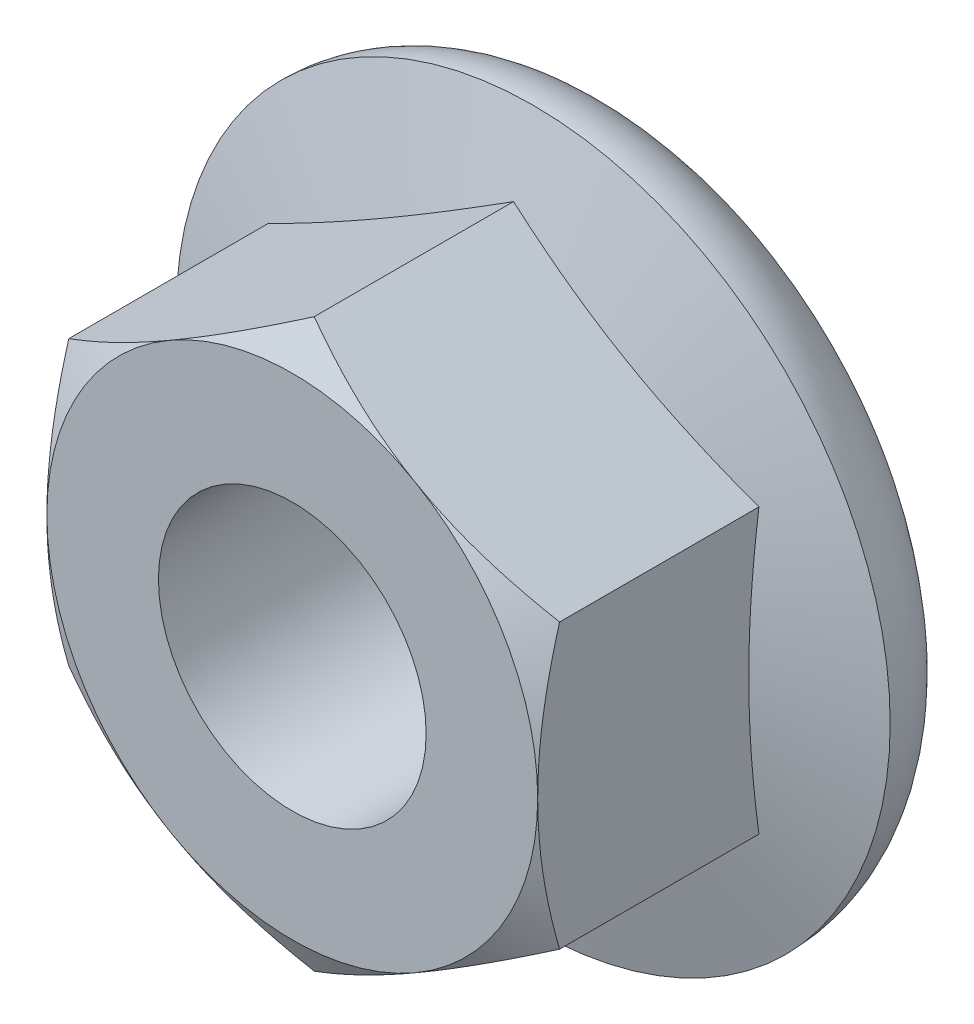
ISO-10303-21;
HEADER;
FILE_DESCRIPTION(('STEP AP214'),'2;1');
FILE_NAME('part.step','',(''),(''),'','','');
FILE_SCHEMA(('AUTOMOTIVE_DESIGN { 1 0 10303 214 1 1 1 1 }'));
ENDSEC;
DATA;
#1=APPLICATION_CONTEXT('core data for automotive mechanical design processes');
#2=APPLICATION_PROTOCOL_DEFINITION('international standard','automotive_design',2000,#1);
#3=PRODUCT_CONTEXT('',#1,'mechanical');
#4=PRODUCT('Part','Part','',(#3));
#5=PRODUCT_RELATED_PRODUCT_CATEGORY('part','',(#4));
#6=PRODUCT_DEFINITION_FORMATION('','',#4);
#7=PRODUCT_DEFINITION_CONTEXT('part definition',#1,'design');
#8=PRODUCT_DEFINITION('design','',#6,#7);
#9=PRODUCT_DEFINITION_SHAPE('','',#8);
#10=(LENGTH_UNIT() NAMED_UNIT(*) SI_UNIT(.MILLI.,.METRE.));
#11=(NAMED_UNIT(*) PLANE_ANGLE_UNIT() SI_UNIT($,.RADIAN.));
#12=(NAMED_UNIT(*) SI_UNIT($,.STERADIAN.) SOLID_ANGLE_UNIT());
#13=UNCERTAINTY_MEASURE_WITH_UNIT(LENGTH_MEASURE(1.E-05),#10,'distance_accuracy_value','');
#14=(GEOMETRIC_REPRESENTATION_CONTEXT(3) GLOBAL_UNCERTAINTY_ASSIGNED_CONTEXT((#13)) GLOBAL_UNIT_ASSIGNED_CONTEXT((#10,
#11,#12)) REPRESENTATION_CONTEXT('',''));
#15=CARTESIAN_POINT('',(0.,0.,0.));
#16=DIRECTION('',(0.,0.,1.));
#17=DIRECTION('',(1.,0.,0.));
#18=AXIS2_PLACEMENT_3D('',#15,#16,#17);
#19=CARTESIAN_POINT('',(0.,0.,1.));
#20=DIRECTION('',(0.,0.,-1.));
#21=DIRECTION('',(-1.,0.,0.));
#22=AXIS2_PLACEMENT_3D('',#19,#20,#21);
#23=CONICAL_SURFACE('',#22,4.,1.30899693899575);
#24=CARTESIAN_POINT('',(0.,0.,1.));
#25=DIRECTION('',(0.,0.,-1.));
#26=DIRECTION('',(-1.,0.,0.));
#27=AXIS2_PLACEMENT_3D('',#24,#25,#26);
#28=CIRCLE('',#27,4.);
#29=CARTESIAN_POINT('',(-4.,0.,1.));
#30=VERTEX_POINT('',#29);
#31=EDGE_CURVE('E245',#30,#30,#28,.T.);
#32=ORIENTED_EDGE('',*,*,#31,.F.);
#33=EDGE_LOOP('',(#32));
#34=FACE_BOUND('',#33,.T.);
#35=CARTESIAN_POINT('',(2.7502,1.58759777021763,1.22091286684335));
#36=CARTESIAN_POINT('',(2.63598285454709,1.65354106989094,1.23859092960394));
#37=CARTESIAN_POINT('',(2.52155860080834,1.71960394358883,1.25463977891833));
#38=CARTESIAN_POINT('',(2.29230593851367,1.8519630298771,1.28283620538909));
#39=CARTESIAN_POINT('',(2.17747738484796,1.91825932624665,1.2949821974403));
#40=CARTESIAN_POINT('',(1.94811243055201,2.05068324435208,1.31466374229249));
#41=CARTESIAN_POINT('',(1.83357758136237,2.11680997036332,1.32222276945591));
#42=CARTESIAN_POINT('',(1.60436179973292,2.24914776358959,1.33235866146379));
#43=CARTESIAN_POINT('',(1.48968089986646,2.3153588119984,1.33493649053889));
#44=CARTESIAN_POINT('',(1.26031910013354,2.44778090881602,1.33493649053889));
#45=CARTESIAN_POINT('',(1.14563820026708,2.51399195722483,1.33235866146379));
#46=CARTESIAN_POINT('',(0.916422418637629,2.6463297504511,1.32222276945591));
#47=CARTESIAN_POINT('',(0.801887569447983,2.71245647646233,1.31466374229249));
#48=CARTESIAN_POINT('',(0.572522615152034,2.84488039456777,1.2949821974403));
#49=CARTESIAN_POINT('',(0.457694061486331,2.91117669093732,1.28283620538908));
#50=CARTESIAN_POINT('',(0.228441399191654,3.04353577722559,1.25463977891833));
#51=CARTESIAN_POINT('',(0.114017145452911,3.10959865092347,1.23859092960394));
#52=CARTESIAN_POINT('',(-0.000200000000001269,3.17554195059678,1.22091286684334));
#53=B_SPLINE_CURVE_WITH_KNOTS('',3,(#35,#36,#37,#38,#39,#40,#41,#42,#43,#44,#45,#46,#47,#48,#49,
#50,#51,#52),.UNSPECIFIED.,.F.,.F.,(4,2,2,2,2,2,2,2,4),(0.,0.399219246203696,0.798600426844827,
1.19592009799431,1.59316285066086,1.99040560332741,2.38772527447689,2.78710645511802,
3.18632570132172),.UNSPECIFIED.);
#54=CARTESIAN_POINT('',(2.75,1.58771324027147,1.2209438086386));
#55=VERTEX_POINT('',#54);
#56=CARTESIAN_POINT('',(0.,3.17542648054294,1.2209438086386));
#57=VERTEX_POINT('',#56);
#58=EDGE_CURVE('E211',#55,#57,#53,.T.);
#59=ORIENTED_EDGE('',*,*,#58,.F.);
#60=CARTESIAN_POINT('',(2.75,-4.16062066673671,0.735450994269951));
#61=CARTESIAN_POINT('',(2.75,-4.03625740392338,0.763243188253374));
#62=CARTESIAN_POINT('',(2.75,-3.91181528487442,0.790688175418964));
#63=CARTESIAN_POINT('',(2.75,-3.66273452297775,0.844697610562519));
#64=CARTESIAN_POINT('',(2.75,-3.53809587160399,0.871262019172854));
#65=CARTESIAN_POINT('',(2.75,-3.28846816239128,0.923347982531177));
#66=CARTESIAN_POINT('',(2.75,-3.16347887765002,0.948868455387664));
#67=CARTESIAN_POINT('',(2.75,-2.9132376076197,0.998579711320544));
#68=CARTESIAN_POINT('',(2.75,-2.78798562465278,1.02277050609969));
#69=CARTESIAN_POINT('',(2.75,-2.41398481850559,1.09249158369686));
#70=CARTESIAN_POINT('',(2.75,-2.16478318721678,1.13564144783868));
#71=CARTESIAN_POINT('',(2.75,-1.66485822488554,1.21216961355586));
#72=CARTESIAN_POINT('',(2.75,-1.41413518815614,1.24554974719148));
#73=CARTESIAN_POINT('',(2.75,-1.03548723792698,1.28505465366859));
#74=CARTESIAN_POINT('',(2.75,-0.908119163728154,1.29649607617542));
#75=CARTESIAN_POINT('',(2.75,-0.653078076382135,1.31515582123165));
#76=CARTESIAN_POINT('',(2.75,-0.525405089746715,1.32237449841729));
#77=CARTESIAN_POINT('',(2.75,-0.269931513005571,1.3321696564195));
#78=CARTESIAN_POINT('',(2.75,-0.142130998962681,1.33474808465582));
#79=CARTESIAN_POINT('',(2.75,0.113477070519372,1.33510489664446));
#80=CARTESIAN_POINT('',(2.75,0.241284625965629,1.33288327546918));
#81=CARTESIAN_POINT('',(2.75,0.497270934270939,1.32376210302994));
#82=CARTESIAN_POINT('',(2.75,0.625448968863491,1.31684279348511));
#83=CARTESIAN_POINT('',(2.75,0.881502532149098,1.29871417201102));
#84=CARTESIAN_POINT('',(2.75,1.00937804436863,1.28750463163662));
#85=CARTESIAN_POINT('',(2.75,1.26482457888099,1.26135225238236));
#86=CARTESIAN_POINT('',(2.75,1.39239535058942,1.24640700235849));
#87=CARTESIAN_POINT('',(2.75,1.64712698992601,1.21339295780904));
#88=CARTESIAN_POINT('',(2.75,1.77428785784416,1.19532416549377));
#89=CARTESIAN_POINT('',(2.75,2.03759820437496,1.15520243412873));
#90=CARTESIAN_POINT('',(2.75,2.17371761326357,1.13295376074119));
#91=CARTESIAN_POINT('',(2.75,2.44555271585937,1.08610678885432));
#92=CARTESIAN_POINT('',(2.75,2.58126839528025,1.06150840820473));
#93=CARTESIAN_POINT('',(2.75,2.98792770575661,0.984941727196996));
#94=CARTESIAN_POINT('',(2.75,3.25834868975596,0.930207483843097));
#95=CARTESIAN_POINT('',(2.75,3.79828439139162,0.816085636971463));
#96=CARTESIAN_POINT('',(2.75,4.06779876711447,0.756696446964855));
#97=CARTESIAN_POINT('',(2.75,4.60614252443845,0.6348715951873));
#98=CARTESIAN_POINT('',(2.75,4.87497188851038,0.572435856263909));
#99=CARTESIAN_POINT('',(2.75,5.40862011788697,0.446334013977838));
#100=CARTESIAN_POINT('',(2.75,5.67344536283982,0.382694765729828));
#101=CARTESIAN_POINT('',(2.75,6.20275703213218,0.253995718950241));
#102=CARTESIAN_POINT('',(2.75,6.46724344749696,0.1889358835822));
#103=CARTESIAN_POINT('',(2.75,6.99556118861478,0.0578885819582806));
#104=CARTESIAN_POINT('',(2.75,7.25939290013671,-0.00809733242031977));
#105=CARTESIAN_POINT('',(2.75,7.78684979853139,-0.140846989539777));
#106=CARTESIAN_POINT('',(2.75,8.0504749930254,-0.207610701979257));
#107=CARTESIAN_POINT('',(2.75,8.31403114505651,-0.274642950573695));
#108=B_SPLINE_CURVE_WITH_KNOTS('',3,(#60,#61,#62,#63,#64,#65,#66,#67,#68,#69,#70,#71,#72,#73,
#74,#75,#76,#77,#78,#79,#80,#81,#82,#83,#84,#85,#86,#87,#88,#89,#90,#91,#92,#93,#94,#95,#96,#97,
#98,#99,#100,#101,#102,#103,#104,#105,#106,#107),.UNSPECIFIED.,.F.,.F.,(4,2,2,2,2,2,2,2,2,2,2,2,
2,2,2,2,2,2,2,2,2,2,2,4),(0.,0.382293883689602,0.764604835433606,1.14730244795921,
1.52999669174893,2.28861409842277,3.04708915474271,3.43067323309062,3.81422509250522,
4.19761594529877,4.58100719167077,4.9660210378108,5.35105538792448,5.73633889587876,
6.12162213119614,6.53537291879723,6.94913817721695,7.77677474640824,8.60469462579245,
9.43263548275771,10.249723745859,11.0668332216481,11.8827068186136,12.6985487364479),.UNSPECIFIED.);
#109=CARTESIAN_POINT('',(2.75,-1.58771324027147,1.2209438086386));
#110=VERTEX_POINT('',#109);
#111=EDGE_CURVE('E133',#110,#55,#108,.T.);
#112=ORIENTED_EDGE('',*,*,#111,.F.);
#113=CARTESIAN_POINT('',(-0.000200000000000533,-3.17554195059678,1.22091286684335));
#114=CARTESIAN_POINT('',(0.114017145452911,-3.10959865092347,1.23859092960394));
#115=CARTESIAN_POINT('',(0.228441399191654,-3.04353577722558,1.25463977891833));
#116=CARTESIAN_POINT('',(0.457694061486331,-2.91117669093731,1.28283620538908));
#117=CARTESIAN_POINT('',(0.572522615152035,-2.84488039456777,1.2949821974403));
#118=CARTESIAN_POINT('',(0.801887569447984,-2.71245647646233,1.31466374229249));
#119=CARTESIAN_POINT('',(0.91642241863763,-2.6463297504511,1.32222276945591));
#120=CARTESIAN_POINT('',(1.14563820026708,-2.51399195722482,1.33235866146379));
#121=CARTESIAN_POINT('',(1.26031910013354,-2.44778090881602,1.33493649053889));
#122=CARTESIAN_POINT('',(1.48968089986646,-2.3153588119984,1.33493649053889));
#123=CARTESIAN_POINT('',(1.60436179973292,-2.24914776358959,1.33235866146379));
#124=CARTESIAN_POINT('',(1.83357758136237,-2.11680997036332,1.32222276945591));
#125=CARTESIAN_POINT('',(1.94811243055201,-2.05068324435208,1.31466374229249));
#126=CARTESIAN_POINT('',(2.17747738484796,-1.91825932624665,1.2949821974403));
#127=CARTESIAN_POINT('',(2.29230593851367,-1.8519630298771,1.28283620538908));
#128=CARTESIAN_POINT('',(2.52155860080834,-1.71960394358883,1.25463977891833));
#129=CARTESIAN_POINT('',(2.63598285454709,-1.65354106989094,1.23859092960394));
#130=CARTESIAN_POINT('',(2.7502,-1.58759777021763,1.22091286684334));
#131=B_SPLINE_CURVE_WITH_KNOTS('',3,(#113,#114,#115,#116,#117,#118,#119,#120,#121,#122,#123,
#124,#125,#126,#127,#128,#129,#130),.UNSPECIFIED.,.F.,.F.,(4,2,2,2,2,2,2,2,4),(0.,
0.399219246203695,0.798600426844826,1.19592009799431,1.59316285066086,1.99040560332741,
2.38772527447689,2.78710645511802,3.18632570132172),.UNSPECIFIED.);
#132=CARTESIAN_POINT('',(0.,-3.17542648054294,1.2209438086386));
#133=VERTEX_POINT('',#132);
#134=EDGE_CURVE('E187',#133,#110,#131,.T.);
#135=ORIENTED_EDGE('',*,*,#134,.F.);
#136=CARTESIAN_POINT('',(-2.7502,-1.58759777021763,1.22091286684334));
#137=CARTESIAN_POINT('',(-2.63598285454709,-1.65354106989094,1.23859092960394));
#138=CARTESIAN_POINT('',(-2.52155860080835,-1.71960394358883,1.25463977891833));
#139=CARTESIAN_POINT('',(-2.29230593851367,-1.8519630298771,1.28283620538908));
#140=CARTESIAN_POINT('',(-2.17747738484797,-1.91825932624665,1.2949821974403));
#141=CARTESIAN_POINT('',(-1.94811243055202,-2.05068324435208,1.31466374229249));
#142=CARTESIAN_POINT('',(-1.83357758136237,-2.11680997036331,1.32222276945591));
#143=CARTESIAN_POINT('',(-1.60436179973292,-2.24914776358959,1.33235866146379));
#144=CARTESIAN_POINT('',(-1.48968089986646,-2.3153588119984,1.33493649053889));
#145=CARTESIAN_POINT('',(-1.26031910013354,-2.44778090881601,1.33493649053889));
#146=CARTESIAN_POINT('',(-1.14563820026708,-2.51399195722482,1.33235866146379));
#147=CARTESIAN_POINT('',(-0.916422418637631,-2.6463297504511,1.32222276945591));
#148=CARTESIAN_POINT('',(-0.801887569447986,-2.71245647646233,1.31466374229249));
#149=CARTESIAN_POINT('',(-0.572522615152037,-2.84488039456776,1.2949821974403));
#150=CARTESIAN_POINT('',(-0.457694061486333,-2.91117669093731,1.28283620538909));
#151=CARTESIAN_POINT('',(-0.228441399191656,-3.04353577722558,1.25463977891833));
#152=CARTESIAN_POINT('',(-0.114017145452912,-3.10959865092347,1.23859092960394));
#153=CARTESIAN_POINT('',(0.000199999999999403,-3.17554195059678,1.22091286684335));
#154=B_SPLINE_CURVE_WITH_KNOTS('',3,(#136,#137,#138,#139,#140,#141,#142,#143,#144,#145,#146,
#147,#148,#149,#150,#151,#152,#153),.UNSPECIFIED.,.F.,.F.,(4,2,2,2,2,2,2,2,4),(0.,
0.399219246203695,0.798600426844826,1.19592009799431,1.59316285066086,1.99040560332741,
2.38772527447689,2.78710645511802,3.18632570132172),.UNSPECIFIED.);
#155=CARTESIAN_POINT('',(-2.75,-1.58771324027147,1.2209438086386));
#156=VERTEX_POINT('',#155);
#157=EDGE_CURVE('E194',#156,#133,#154,.T.);
#158=ORIENTED_EDGE('',*,*,#157,.F.);
#159=CARTESIAN_POINT('',(-2.75,-4.16062066663957,0.735450994291667));
#160=CARTESIAN_POINT('',(-2.75,-4.03625740383016,0.763243188274016));
#161=CARTESIAN_POINT('',(-2.75,-3.91181528478513,0.790688175438535));
#162=CARTESIAN_POINT('',(-2.75,-3.66273452289632,0.844697610579965));
#163=CARTESIAN_POINT('',(-2.75,-3.53809587152649,0.871262019189245));
#164=CARTESIAN_POINT('',(-2.75,-3.28846816232167,0.923347982545481));
#165=CARTESIAN_POINT('',(-2.75,-3.16347887758436,0.948868455400935));
#166=CARTESIAN_POINT('',(-2.75,-2.91323760756196,0.998579711331788));
#167=CARTESIAN_POINT('',(-2.75,-2.787985624599,1.02277050610994));
#168=CARTESIAN_POINT('',(-2.75,-2.4139848184635,1.09249158370426));
#169=CARTESIAN_POINT('',(-2.75,-2.16478318718245,1.1356414478443));
#170=CARTESIAN_POINT('',(-2.75,-1.66485822486679,1.21216961355838));
#171=CARTESIAN_POINT('',(-2.75,-1.41413518814522,1.24554974719268));
#172=CARTESIAN_POINT('',(-2.75,-1.03548723792831,1.28505465366842));
#173=CARTESIAN_POINT('',(-2.75,-0.908119163733856,1.29649607617489));
#174=CARTESIAN_POINT('',(-2.75,-0.653078076396612,1.31515582123071));
#175=CARTESIAN_POINT('',(-2.75,-0.525405089765589,1.32237449841628));
#176=CARTESIAN_POINT('',(-2.75,-0.269931513033236,1.33216965641872));
#177=CARTESIAN_POINT('',(-2.75,-0.142130998994741,1.33474808465532));
#178=CARTESIAN_POINT('',(-2.75,0.113477070478539,1.33510489664485));
#179=CARTESIAN_POINT('',(-2.75,0.241284625920418,1.33288327547019));
#180=CARTESIAN_POINT('',(-2.75,0.497270934216968,1.32376210303246));
#181=CARTESIAN_POINT('',(-2.75,0.625448968805138,1.31684279348854));
#182=CARTESIAN_POINT('',(-2.75,0.881502532082021,1.29871417201647));
#183=CARTESIAN_POINT('',(-2.75,1.00937804429721,1.28750463164319));
#184=CARTESIAN_POINT('',(-2.75,1.26482457880091,1.2613522523913));
#185=CARTESIAN_POINT('',(-2.75,1.39239535050502,1.24640700236869));
#186=CARTESIAN_POINT('',(-2.75,1.647126989833,1.21339295782183));
#187=CARTESIAN_POINT('',(-2.75,1.77428785774687,1.1953241655079));
#188=CARTESIAN_POINT('',(-2.75,2.0375982042735,1.15520243414494));
#189=CARTESIAN_POINT('',(-2.75,2.1737176131622,1.13295376075806));
#190=CARTESIAN_POINT('',(-2.75,2.4455527157582,1.08610678887236));
#191=CARTESIAN_POINT('',(-2.75,2.58126839517917,1.06150840822328));
#192=CARTESIAN_POINT('',(-2.75,2.98792770565579,0.984941727216942));
#193=CARTESIAN_POINT('',(-2.75,3.25834868965529,0.930207483863758));
#194=CARTESIAN_POINT('',(-2.75,3.79828439129123,0.816085636993291));
#195=CARTESIAN_POINT('',(-2.75,4.06779876701422,0.756696446987135));
#196=CARTESIAN_POINT('',(-2.75,4.60614252433846,0.634871595210329));
#197=CARTESIAN_POINT('',(-2.75,4.8749718884105,0.572435856287235));
#198=CARTESIAN_POINT('',(-2.75,5.40862011778745,0.446334014001625));
#199=CARTESIAN_POINT('',(-2.75,5.67344536274053,0.382694765753781));
#200=CARTESIAN_POINT('',(-2.75,6.20275703203334,0.253995718974463));
#201=CARTESIAN_POINT('',(-2.75,6.46724344739835,0.188935883606524));
#202=CARTESIAN_POINT('',(-2.75,6.99556118851652,0.0578885819827905));
#203=CARTESIAN_POINT('',(-2.75,7.25939290003859,-0.00809733239572739));
#204=CARTESIAN_POINT('',(-2.75,7.78684979843353,-0.140846989515047));
#205=CARTESIAN_POINT('',(-2.75,8.05047499292766,-0.207610701954473));
#206=CARTESIAN_POINT('',(-2.75,8.3140311449589,-0.274642950548864));
#207=B_SPLINE_CURVE_WITH_KNOTS('',3,(#159,#160,#161,#162,#163,#164,#165,#166,#167,#168,#169,
#170,#171,#172,#173,#174,#175,#176,#177,#178,#179,#180,#181,#182,#183,#184,#185,#186,#187,#188,
#189,#190,#191,#192,#193,#194,#195,#196,#197,#198,#199,#200,#201,#202,#203,#204,#205,#206),
.UNSPECIFIED.,.F.,.F.,(4,2,2,2,2,2,2,2,2,2,2,2,2,2,2,2,2,2,2,2,2,2,2,4),(0.,0.382293883677403,
0.764604835409208,1.14730244792257,1.52999669170005,2.28861409835008,3.04708915464623,
3.43067323298096,3.81422509238239,4.1976159451628,4.58100719152164,4.9660210376484,
5.35105538774881,5.73633889568978,6.12162213099386,6.53537291859494,6.94913817701465,
7.77677474620594,8.60469462559026,9.43263548255566,10.2497237456575,11.0668332214472,
11.8827068184131,12.6985487362477),.UNSPECIFIED.);
#208=CARTESIAN_POINT('',(-2.75,1.58771324027147,1.2209438086386));
#209=VERTEX_POINT('',#208);
#210=EDGE_CURVE('E199',#209,#156,#207,.F.);
#211=ORIENTED_EDGE('',*,*,#210,.F.);
#212=CARTESIAN_POINT('',(0.000199999999999247,3.17554195059678,1.22091286684334));
#213=CARTESIAN_POINT('',(-0.114017145452912,3.10959865092347,1.23859092960394));
#214=CARTESIAN_POINT('',(-0.228441399191655,3.04353577722559,1.25463977891833));
#215=CARTESIAN_POINT('',(-0.457694061486333,2.91117669093732,1.28283620538908));
#216=CARTESIAN_POINT('',(-0.572522615152036,2.84488039456777,1.2949821974403));
#217=CARTESIAN_POINT('',(-0.801887569447985,2.71245647646233,1.31466374229249));
#218=CARTESIAN_POINT('',(-0.916422418637631,2.6463297504511,1.32222276945591));
#219=CARTESIAN_POINT('',(-1.14563820026708,2.51399195722483,1.33235866146379));
#220=CARTESIAN_POINT('',(-1.26031910013354,2.44778090881602,1.33493649053889));
#221=CARTESIAN_POINT('',(-1.48968089986646,2.3153588119984,1.33493649053889));
#222=CARTESIAN_POINT('',(-1.60436179973292,2.24914776358959,1.33235866146379));
#223=CARTESIAN_POINT('',(-1.83357758136237,2.11680997036331,1.32222276945591));
#224=CARTESIAN_POINT('',(-1.94811243055202,2.05068324435208,1.31466374229249));
#225=CARTESIAN_POINT('',(-2.17747738484796,1.91825932624665,1.2949821974403));
#226=CARTESIAN_POINT('',(-2.29230593851367,1.8519630298771,1.28283620538908));
#227=CARTESIAN_POINT('',(-2.52155860080835,1.71960394358883,1.25463977891833));
#228=CARTESIAN_POINT('',(-2.63598285454709,1.65354106989094,1.23859092960394));
#229=CARTESIAN_POINT('',(-2.7502,1.58759777021763,1.22091286684334));
#230=B_SPLINE_CURVE_WITH_KNOTS('',3,(#212,#213,#214,#215,#216,#217,#218,#219,#220,#221,#222,
#223,#224,#225,#226,#227,#228,#229),.UNSPECIFIED.,.F.,.F.,(4,2,2,2,2,2,2,2,4),(0.,
0.399219246203695,0.798600426844827,1.19592009799431,1.59316285066086,1.99040560332741,
2.38772527447689,2.78710645511802,3.18632570132172),.UNSPECIFIED.);
#231=EDGE_CURVE('E205',#57,#209,#230,.T.);
#232=ORIENTED_EDGE('',*,*,#231,.F.);
#233=EDGE_LOOP('',(#59,#112,#135,#158,#211,#232));
#234=FACE_BOUND('',#233,.T.);
#235=ADVANCED_FACE('F35',(#34,#234),#23,.T.);
#236=CARTESIAN_POINT('',(0.,0.,0.));
#237=DIRECTION('',(0.,0.,-1.));
#238=DIRECTION('',(-1.,0.,0.));
#239=AXIS2_PLACEMENT_3D('',#236,#237,#238);
#240=PLANE('',#239);
#241=CARTESIAN_POINT('',(0.,0.,0.));
#242=DIRECTION('',(0.,0.,-1.));
#243=DIRECTION('',(-1.,0.,0.));
#244=AXIS2_PLACEMENT_3D('',#241,#242,#243);
#245=CIRCLE('',#244,1.5);
#246=CARTESIAN_POINT('',(-1.5,0.,0.));
#247=VERTEX_POINT('',#246);
#248=EDGE_CURVE('E311',#247,#247,#245,.T.);
#249=ORIENTED_EDGE('',*,*,#248,.F.);
#250=EDGE_LOOP('',(#249));
#251=FACE_BOUND('',#250,.T.);
#252=CARTESIAN_POINT('',(0.,0.,0.));
#253=DIRECTION('',(0.,0.,-1.));
#254=DIRECTION('',(-1.,0.,0.));
#255=AXIS2_PLACEMENT_3D('',#252,#253,#254);
#256=CIRCLE('',#255,3.);
#257=CARTESIAN_POINT('',(-3.,0.,0.));
#258=VERTEX_POINT('',#257);
#259=EDGE_CURVE('E248',#258,#258,#256,.T.);
#260=ORIENTED_EDGE('',*,*,#259,.T.);
#261=EDGE_LOOP('',(#260));
#262=FACE_BOUND('',#261,.T.);
#263=ADVANCED_FACE('F178',(#251,#262),#240,.T.);
#264=CARTESIAN_POINT('',(0.,0.,1.));
#265=DIRECTION('',(0.,0.,-1.));
#266=DIRECTION('',(-1.,0.,0.));
#267=AXIS2_PLACEMENT_3D('',#264,#265,#266);
#268=TOROIDAL_SURFACE('',#267,3.,1.);
#269=ORIENTED_EDGE('',*,*,#31,.T.);
#270=EDGE_LOOP('',(#269));
#271=FACE_BOUND('',#270,.T.);
#272=ORIENTED_EDGE('',*,*,#259,.F.);
#273=EDGE_LOOP('',(#272));
#274=FACE_BOUND('',#273,.T.);
#275=ADVANCED_FACE('F180',(#271,#274),#268,.T.);
#276=CARTESIAN_POINT('',(2.75,1.58771324027147,3.7));
#277=DIRECTION('',(-0.5,-0.866025403784439,0.));
#278=DIRECTION('',(0.866025403784439,-0.5,0.));
#279=AXIS2_PLACEMENT_3D('',#276,#277,#278);
#280=PLANE('',#279);
#281=DIRECTION('',(0.,0.,-1.));
#282=VECTOR('',#281,1.);
#283=CARTESIAN_POINT('',(0.,3.17542648054294,3.7));
#284=LINE('',#283,#282);
#285=CARTESIAN_POINT('',(0.,3.17542648054294,3.45437990693814));
#286=VERTEX_POINT('',#285);
#287=EDGE_CURVE('E173',#286,#57,#284,.T.);
#288=ORIENTED_EDGE('',*,*,#287,.F.);
#289=CARTESIAN_POINT('',(-0.000200000000000801,3.17554195059678,3.45431323663524));
#290=CARTESIAN_POINT('',(0.120649220659905,3.10576962051743,3.49461233775074));
#291=CARTESIAN_POINT('',(0.242541602622633,3.03539502097908,3.53126309740234));
#292=CARTESIAN_POINT('',(0.488437126727892,2.89342717394439,3.5952378170302));
#293=CARTESIAN_POINT('',(0.612444638573854,2.82183140359858,3.6225391443255));
#294=CARTESIAN_POINT('',(0.858922797975942,2.67952717191843,3.66503825470588));
#295=CARTESIAN_POINT('',(0.981355518587416,2.60884060771577,3.68051888137754));
#296=CARTESIAN_POINT('',(1.22679714236891,2.46713482015519,3.69900060263006));
#297=CARTESIAN_POINT('',(1.34980515323291,2.39611611197038,3.7020170005374));
#298=CARTESIAN_POINT('',(1.57965878661079,2.26341005486544,3.69574685457145));
#299=CARTESIAN_POINT('',(1.68653879125402,2.20170285541369,3.6879998457233));
#300=CARTESIAN_POINT('',(1.89960246733475,2.07869048467395,3.66344481893565));
#301=CARTESIAN_POINT('',(2.00578540164889,2.01738573896434,3.64662841034943));
#302=CARTESIAN_POINT('',(2.21928848939318,1.89411967378235,3.60458807765405));
#303=CARTESIAN_POINT('',(2.32658161614285,1.83217395817123,3.57918591931277));
#304=CARTESIAN_POINT('',(2.53956747928405,1.70920651275308,3.52153277416002));
#305=CARTESIAN_POINT('',(2.64526294502665,1.64818320715446,3.48929533670102));
#306=CARTESIAN_POINT('',(2.7502,1.58759777021763,3.45431323663524));
#307=B_SPLINE_CURVE_WITH_KNOTS('',3,(#289,#290,#291,#292,#293,#294,#295,#296,#297,#298,#299,
#300,#301,#302,#303,#304,#305,#306),.UNSPECIFIED.,.F.,.F.,(4,2,2,2,2,2,2,2,4),(0.,
0.435912828725887,0.872873557116331,1.29901931904671,1.72464171213573,2.09526089052937,
2.46622354066374,2.84541551798557,3.22386274754524),.UNSPECIFIED.);
#308=CARTESIAN_POINT('',(1.375,2.38156986040721,3.7));
#309=VERTEX_POINT('',#308);
#310=EDGE_CURVE('E297',#286,#309,#307,.T.);
#311=ORIENTED_EDGE('',*,*,#310,.T.);
#312=CARTESIAN_POINT('',(2.75,1.58771324027147,3.45437990693814));
#313=VERTEX_POINT('',#312);
#314=EDGE_CURVE('E127',#309,#313,#307,.T.);
#315=ORIENTED_EDGE('',*,*,#314,.T.);
#316=DIRECTION('',(0.,0.,-1.));
#317=VECTOR('',#316,1.);
#318=CARTESIAN_POINT('',(2.75,1.58771324027147,3.7));
#319=LINE('',#318,#317);
#320=EDGE_CURVE('E139',#313,#55,#319,.T.);
#321=ORIENTED_EDGE('',*,*,#320,.T.);
#322=ORIENTED_EDGE('',*,*,#58,.T.);
#323=EDGE_LOOP('',(#288,#311,#315,#321,#322));
#324=FACE_BOUND('',#323,.T.);
#325=ADVANCED_FACE('F37',(#324),#280,.F.);
#326=CARTESIAN_POINT('',(0.,3.17542648054294,3.7));
#327=DIRECTION('',(0.5,-0.866025403784439,0.));
#328=DIRECTION('',(0.866025403784438,0.5,0.));
#329=AXIS2_PLACEMENT_3D('',#326,#327,#328);
#330=PLANE('',#329);
#331=DIRECTION('',(0.,0.,-1.));
#332=VECTOR('',#331,1.);
#333=CARTESIAN_POINT('',(-2.75,1.58771324027147,3.7));
#334=LINE('',#333,#332);
#335=CARTESIAN_POINT('',(-2.75,1.58771324027147,3.45437990693814));
#336=VERTEX_POINT('',#335);
#337=EDGE_CURVE('E275',#336,#209,#334,.T.);
#338=ORIENTED_EDGE('',*,*,#337,.F.);
#339=CARTESIAN_POINT('',(-2.7502,1.58759777021763,3.45431323663524));
#340=CARTESIAN_POINT('',(-2.62935077934009,1.65737010029699,3.49461233775074));
#341=CARTESIAN_POINT('',(-2.50745839737737,1.72774469983533,3.53126309740234));
#342=CARTESIAN_POINT('',(-2.26156287327211,1.86971254687003,3.5952378170302));
#343=CARTESIAN_POINT('',(-2.13755536142615,1.94130831721583,3.6225391443255));
#344=CARTESIAN_POINT('',(-1.89107720202406,2.08361254889599,3.66503825470588));
#345=CARTESIAN_POINT('',(-1.76864448141259,2.15429911309864,3.68051888137754));
#346=CARTESIAN_POINT('',(-1.52320285763109,2.29600490065923,3.69900060263006));
#347=CARTESIAN_POINT('',(-1.40019484676709,2.36702360884404,3.7020170005374));
#348=CARTESIAN_POINT('',(-1.17034121338921,2.49972966594897,3.69574685457145));
#349=CARTESIAN_POINT('',(-1.06346120874598,2.56143686540073,3.6879998457233));
#350=CARTESIAN_POINT('',(-0.850397532665252,2.68444923614047,3.66344481893565));
#351=CARTESIAN_POINT('',(-0.744214598351113,2.74575398185008,3.64662841034943));
#352=CARTESIAN_POINT('',(-0.530711510606818,2.86902004703206,3.60458807765405));
#353=CARTESIAN_POINT('',(-0.423418383857147,2.93096576264318,3.57918591931277));
#354=CARTESIAN_POINT('',(-0.21043252071595,3.05393320806134,3.52153277416002));
#355=CARTESIAN_POINT('',(-0.104737054973349,3.11495651365995,3.48929533670102));
#356=CARTESIAN_POINT('',(0.000199999999998998,3.17554195059678,3.45431323663524));
#357=B_SPLINE_CURVE_WITH_KNOTS('',3,(#339,#340,#341,#342,#343,#344,#345,#346,#347,#348,#349,
#350,#351,#352,#353,#354,#355,#356),.UNSPECIFIED.,.F.,.F.,(4,2,2,2,2,2,2,2,4),(0.,
0.435912828725887,0.87287355711633,1.29901931904671,1.72464171213573,2.09526089052937,
2.46622354066374,2.84541551798557,3.22386274754524),.UNSPECIFIED.);
#358=CARTESIAN_POINT('',(-1.375,2.38156986040721,3.7));
#359=VERTEX_POINT('',#358);
#360=EDGE_CURVE('E232',#336,#359,#357,.T.);
#361=ORIENTED_EDGE('',*,*,#360,.T.);
#362=EDGE_CURVE('E224',#359,#286,#357,.T.);
#363=ORIENTED_EDGE('',*,*,#362,.T.);
#364=ORIENTED_EDGE('',*,*,#287,.T.);
#365=ORIENTED_EDGE('',*,*,#231,.T.);
#366=EDGE_LOOP('',(#338,#361,#363,#364,#365));
#367=FACE_BOUND('',#366,.T.);
#368=ADVANCED_FACE('F216',(#367),#330,.F.);
#369=CARTESIAN_POINT('',(-2.75,1.58771324027147,3.7));
#370=DIRECTION('',(1.,0.,0.));
#371=DIRECTION('',(0.,0.,-1.));
#372=AXIS2_PLACEMENT_3D('',#369,#370,#371);
#373=PLANE('',#372);
#374=DIRECTION('',(0.,0.,-1.));
#375=VECTOR('',#374,1.);
#376=CARTESIAN_POINT('',(-2.75,-1.58771324027147,3.7));
#377=LINE('',#376,#375);
#378=CARTESIAN_POINT('',(-2.75,-1.58771324027147,3.45437990693814));
#379=VERTEX_POINT('',#378);
#380=EDGE_CURVE('E273',#379,#156,#377,.T.);
#381=ORIENTED_EDGE('',*,*,#380,.F.);
#382=CARTESIAN_POINT('',(-2.75,-4.26510950574755,2.35777245042504));
#383=CARTESIAN_POINT('',(-2.75,-4.14499875858726,2.41603820896004));
#384=CARTESIAN_POINT('',(-2.75,-4.02461232765612,2.4737453949288));
#385=CARTESIAN_POINT('',(-2.75,-3.78314149943342,2.58772848645915));
#386=CARTESIAN_POINT('',(-2.75,-3.66205699582414,2.64400416653624));
#387=CARTESIAN_POINT('',(-2.75,-3.41841969124184,2.75509317360131));
#388=CARTESIAN_POINT('',(-2.75,-3.29586248560579,2.80989687376236));
#389=CARTESIAN_POINT('',(-2.75,-3.049773437179,2.9172620376921));
#390=CARTESIAN_POINT('',(-2.75,-2.92624164074825,2.96982360736298));
#391=CARTESIAN_POINT('',(-2.75,-2.67401306448425,3.07375833949831));
#392=CARTESIAN_POINT('',(-2.75,-2.54527793276523,3.12503893776019));
#393=CARTESIAN_POINT('',(-2.75,-2.28630162404454,3.22371978466043));
#394=CARTESIAN_POINT('',(-2.75,-2.15606027988869,3.27111959781412));
#395=CARTESIAN_POINT('',(-2.75,-1.89410807478132,3.36079475709496));
#396=CARTESIAN_POINT('',(-2.75,-1.76240080051129,3.4030804751448));
#397=CARTESIAN_POINT('',(-2.75,-1.49709689690728,3.4811707077853));
#398=CARTESIAN_POINT('',(-2.75,-1.3635008769386,3.51697726352185));
#399=CARTESIAN_POINT('',(-2.75,-1.09508836424644,3.58019963945417));
#400=CARTESIAN_POINT('',(-2.75,-0.960282833114951,3.607661140468));
#401=CARTESIAN_POINT('',(-2.75,-0.688994832454244,3.65264257692727));
#402=CARTESIAN_POINT('',(-2.75,-0.55251252243207,3.67016345062789));
#403=CARTESIAN_POINT('',(-2.75,-0.28033544985462,3.69363664926511));
#404=CARTESIAN_POINT('',(-2.75,-0.144653835955005,3.6997376898024));
#405=CARTESIAN_POINT('',(-2.75,0.126742487000316,3.70024547172404));
#406=CARTESIAN_POINT('',(-2.75,0.262457196613,3.6946520004404));
#407=CARTESIAN_POINT('',(-2.75,0.492852724450968,3.67562460242377));
#408=CARTESIAN_POINT('',(-2.75,0.58778018888124,3.6650039678801));
#409=CARTESIAN_POINT('',(-2.75,0.776938147082504,3.63870246873907));
#410=CARTESIAN_POINT('',(-2.75,0.87116854431143,3.62302091615891));
#411=CARTESIAN_POINT('',(-2.75,1.15267765808897,3.56920689766723));
#412=CARTESIAN_POINT('',(-2.75,1.33866809643857,3.52431499935835));
#413=CARTESIAN_POINT('',(-2.75,1.71088847956003,3.42023568396465));
#414=CARTESIAN_POINT('',(-2.75,1.89703305126468,3.36075452924488));
#415=CARTESIAN_POINT('',(-2.75,2.17366611941342,3.2643520438026));
#416=CARTESIAN_POINT('',(-2.75,2.26543713771323,3.23102491391658));
#417=CARTESIAN_POINT('',(-2.75,2.44822137511288,3.16235356054217));
#418=CARTESIAN_POINT('',(-2.75,2.53923460259994,3.12700935941279));
#419=CARTESIAN_POINT('',(-2.75,2.75196797375469,3.0421221485565));
#420=CARTESIAN_POINT('',(-2.75,2.8734155344011,2.9918980740795));
#421=CARTESIAN_POINT('',(-2.75,3.11528951560145,2.88904269880338));
#422=CARTESIAN_POINT('',(-2.75,3.23571587943299,2.83641126531226));
#423=CARTESIAN_POINT('',(-2.75,3.59576413448949,2.67564414382368));
#424=CARTESIAN_POINT('',(-2.75,3.83410981853281,2.56465419221918));
#425=CARTESIAN_POINT('',(-2.75,4.30864079836104,2.33760774363572));
#426=CARTESIAN_POINT('',(-2.75,4.54482370809503,2.22154631441394));
#427=CARTESIAN_POINT('',(-2.75,5.01548505243664,1.9860049685896));
#428=CARTESIAN_POINT('',(-2.75,5.24996342514982,1.86652492862177));
#429=CARTESIAN_POINT('',(-2.75,5.69834862633679,1.63511295846941));
#430=CARTESIAN_POINT('',(-2.75,5.912354775492,1.52337280463303));
#431=CARTESIAN_POINT('',(-2.75,6.33956547575852,1.29835456208858));
#432=CARTESIAN_POINT('',(-2.75,6.55276999919921,1.18507642090326));
#433=CARTESIAN_POINT('',(-2.75,6.97803074930058,0.957624740026027));
#434=CARTESIAN_POINT('',(-2.75,7.19008850863081,0.843454061672296));
#435=CARTESIAN_POINT('',(-2.75,7.6136900931011,0.614190143302317));
#436=CARTESIAN_POINT('',(-2.75,7.82523394547513,0.499096953627504));
#437=CARTESIAN_POINT('',(-2.75,8.03658809289812,0.383658857249523));
#438=B_SPLINE_CURVE_WITH_KNOTS('',3,(#382,#383,#384,#385,#386,#387,#388,#389,#390,#391,#392,
#393,#394,#395,#396,#397,#398,#399,#400,#401,#402,#403,#404,#405,#406,#407,#408,#409,#410,#411,
#412,#413,#414,#415,#416,#417,#418,#419,#420,#421,#422,#423,#424,#425,#426,#427,#428,#429,#430,
#431,#432,#433,#434,#435,#436,#437),.UNSPECIFIED.,.F.,.F.,(4,2,2,2,2,2,2,2,2,2,2,2,2,2,2,2,2,2,
2,2,2,2,2,2,2,2,2,4),(0.,0.400496354926705,0.801055408462091,1.2037947052646,1.60651495843558,
2.02218514394157,2.43790191038234,2.8527608946239,3.26748895644833,3.67990411232275,
4.09228033553818,4.49924795762454,4.9062229805959,5.19264436826328,5.47910470855723,
6.05234388839899,6.63823919147078,6.93112616857337,7.22400989968441,7.61824443594005,
8.01250072838162,8.80116029266611,9.59060472181353,10.3800776751702,11.1043358509028,
11.8286188012761,12.5511334245615,13.2736088850821),.UNSPECIFIED.);
#439=CARTESIAN_POINT('',(-2.75,0.,3.7));
#440=VERTEX_POINT('',#439);
#441=EDGE_CURVE('E244',#379,#440,#438,.T.);
#442=ORIENTED_EDGE('',*,*,#441,.T.);
#443=EDGE_CURVE('E237',#440,#336,#438,.T.);
#444=ORIENTED_EDGE('',*,*,#443,.T.);
#445=ORIENTED_EDGE('',*,*,#337,.T.);
#446=ORIENTED_EDGE('',*,*,#210,.T.);
#447=EDGE_LOOP('',(#381,#442,#444,#445,#446));
#448=FACE_BOUND('',#447,.T.);
#449=ADVANCED_FACE('F219',(#448),#373,.F.);
#450=CARTESIAN_POINT('',(-2.75,-1.58771324027147,3.7));
#451=DIRECTION('',(0.5,0.866025403784439,0.));
#452=DIRECTION('',(-0.866025403784439,0.5,0.));
#453=AXIS2_PLACEMENT_3D('',#450,#451,#452);
#454=PLANE('',#453);
#455=DIRECTION('',(0.,0.,-1.));
#456=VECTOR('',#455,1.);
#457=CARTESIAN_POINT('',(0.,-3.17542648054294,3.7));
#458=LINE('',#457,#456);
#459=CARTESIAN_POINT('',(0.,-3.17542648054294,3.45437990693814));
#460=VERTEX_POINT('',#459);
#461=EDGE_CURVE('E286',#460,#133,#458,.T.);
#462=ORIENTED_EDGE('',*,*,#461,.F.);
#463=CARTESIAN_POINT('',(0.000199999999999518,-3.17554195059678,3.45431323663524));
#464=CARTESIAN_POINT('',(-0.120649220659907,-3.10576962051743,3.49461233775074));
#465=CARTESIAN_POINT('',(-0.242541602622634,-3.03539502097908,3.53126309740234));
#466=CARTESIAN_POINT('',(-0.488437126727893,-2.89342717394439,3.5952378170302));
#467=CARTESIAN_POINT('',(-0.612444638573855,-2.82183140359858,3.6225391443255));
#468=CARTESIAN_POINT('',(-0.858922797975943,-2.67952717191842,3.66503825470588));
#469=CARTESIAN_POINT('',(-0.981355518587416,-2.60884060771577,3.68051888137754));
#470=CARTESIAN_POINT('',(-1.22679714236891,-2.46713482015518,3.69900060263006));
#471=CARTESIAN_POINT('',(-1.34980515323291,-2.39611611197038,3.7020170005374));
#472=CARTESIAN_POINT('',(-1.57965878661079,-2.26341005486544,3.69574685457145));
#473=CARTESIAN_POINT('',(-1.68653879125402,-2.20170285541369,3.6879998457233));
#474=CARTESIAN_POINT('',(-1.89960246733475,-2.07869048467395,3.66344481893565));
#475=CARTESIAN_POINT('',(-2.00578540164889,-2.01738573896433,3.64662841034943));
#476=CARTESIAN_POINT('',(-2.21928848939318,-1.89411967378235,3.60458807765405));
#477=CARTESIAN_POINT('',(-2.32658161614285,-1.83217395817123,3.57918591931277));
#478=CARTESIAN_POINT('',(-2.53956747928405,-1.70920651275307,3.52153277416002));
#479=CARTESIAN_POINT('',(-2.64526294502665,-1.64818320715446,3.48929533670102));
#480=CARTESIAN_POINT('',(-2.7502,-1.58759777021763,3.45431323663524));
#481=B_SPLINE_CURVE_WITH_KNOTS('',3,(#463,#464,#465,#466,#467,#468,#469,#470,#471,#472,#473,
#474,#475,#476,#477,#478,#479,#480),.UNSPECIFIED.,.F.,.F.,(4,2,2,2,2,2,2,2,4),(0.,
0.435912828725887,0.87287355711633,1.29901931904671,1.72464171213573,2.09526089052937,
2.46622354066374,2.84541551798557,3.22386274754524),.UNSPECIFIED.);
#482=CARTESIAN_POINT('',(-1.375,-2.38156986040721,3.7));
#483=VERTEX_POINT('',#482);
#484=EDGE_CURVE('E233',#460,#483,#481,.T.);
#485=ORIENTED_EDGE('',*,*,#484,.T.);
#486=EDGE_CURVE('E60',#483,#379,#481,.T.);
#487=ORIENTED_EDGE('',*,*,#486,.T.);
#488=ORIENTED_EDGE('',*,*,#380,.T.);
#489=ORIENTED_EDGE('',*,*,#157,.T.);
#490=EDGE_LOOP('',(#462,#485,#487,#488,#489));
#491=FACE_BOUND('',#490,.T.);
#492=ADVANCED_FACE('F299',(#491),#454,.F.);
#493=CARTESIAN_POINT('',(0.,-3.17542648054294,3.7));
#494=DIRECTION('',(-0.499999999999999,0.866025403784439,0.));
#495=DIRECTION('',(-0.866025403784439,-0.5,0.));
#496=AXIS2_PLACEMENT_3D('',#493,#494,#495);
#497=PLANE('',#496);
#498=DIRECTION('',(0.,0.,-1.));
#499=VECTOR('',#498,1.);
#500=CARTESIAN_POINT('',(2.75,-1.58771324027147,3.7));
#501=LINE('',#500,#499);
#502=CARTESIAN_POINT('',(2.75,-1.58771324027147,3.45437990693814));
#503=VERTEX_POINT('',#502);
#504=EDGE_CURVE('E291',#503,#110,#501,.T.);
#505=ORIENTED_EDGE('',*,*,#504,.F.);
#506=CARTESIAN_POINT('',(2.7502,-1.58759777021763,3.45431323663524));
#507=CARTESIAN_POINT('',(2.62935077934009,-1.65737010029699,3.49461233775074));
#508=CARTESIAN_POINT('',(2.50745839737737,-1.72774469983533,3.53126309740234));
#509=CARTESIAN_POINT('',(2.26156287327211,-1.86971254687003,3.5952378170302));
#510=CARTESIAN_POINT('',(2.13755536142614,-1.94130831721583,3.6225391443255));
#511=CARTESIAN_POINT('',(1.89107720202406,-2.08361254889599,3.66503825470588));
#512=CARTESIAN_POINT('',(1.76864448141258,-2.15429911309864,3.68051888137754));
#513=CARTESIAN_POINT('',(1.52320285763108,-2.29600490065923,3.69900060263006));
#514=CARTESIAN_POINT('',(1.40019484676709,-2.36702360884404,3.7020170005374));
#515=CARTESIAN_POINT('',(1.17034121338921,-2.49972966594897,3.69574685457145));
#516=CARTESIAN_POINT('',(1.06346120874598,-2.56143686540073,3.6879998457233));
#517=CARTESIAN_POINT('',(0.85039753266525,-2.68444923614047,3.66344481893565));
#518=CARTESIAN_POINT('',(0.744214598351111,-2.74575398185008,3.64662841034943));
#519=CARTESIAN_POINT('',(0.530711510606816,-2.86902004703206,3.60458807765405));
#520=CARTESIAN_POINT('',(0.423418383857145,-2.93096576264318,3.57918591931277));
#521=CARTESIAN_POINT('',(0.210432520715948,-3.05393320806134,3.52153277416002));
#522=CARTESIAN_POINT('',(0.104737054973347,-3.11495651365995,3.48929533670102));
#523=CARTESIAN_POINT('',(-0.000200000000000415,-3.17554195059678,3.45431323663524));
#524=B_SPLINE_CURVE_WITH_KNOTS('',3,(#506,#507,#508,#509,#510,#511,#512,#513,#514,#515,#516,
#517,#518,#519,#520,#521,#522,#523),.UNSPECIFIED.,.F.,.F.,(4,2,2,2,2,2,2,2,4),(0.,
0.435912828725887,0.872873557116331,1.29901931904671,1.72464171213573,2.09526089052937,
2.46622354066374,2.84541551798557,3.22386274754524),.UNSPECIFIED.);
#525=CARTESIAN_POINT('',(1.375,-2.38156986040721,3.7));
#526=VERTEX_POINT('',#525);
#527=EDGE_CURVE('E114',#503,#526,#524,.T.);
#528=ORIENTED_EDGE('',*,*,#527,.T.);
#529=EDGE_CURVE('E53',#526,#460,#524,.T.);
#530=ORIENTED_EDGE('',*,*,#529,.T.);
#531=ORIENTED_EDGE('',*,*,#461,.T.);
#532=ORIENTED_EDGE('',*,*,#134,.T.);
#533=EDGE_LOOP('',(#505,#528,#530,#531,#532));
#534=FACE_BOUND('',#533,.T.);
#535=ADVANCED_FACE('F163',(#534),#497,.F.);
#536=CARTESIAN_POINT('',(2.75,-1.58771324027147,3.7));
#537=DIRECTION('',(-1.,0.,0.));
#538=DIRECTION('',(0.,-1.,0.));
#539=AXIS2_PLACEMENT_3D('',#536,#537,#538);
#540=PLANE('',#539);
#541=ORIENTED_EDGE('',*,*,#320,.F.);
#542=CARTESIAN_POINT('',(2.75,-4.26510950583397,2.35777245038311));
#543=CARTESIAN_POINT('',(2.75,-4.14499875867077,2.41603820891986));
#544=CARTESIAN_POINT('',(2.75,-4.02461232773673,2.47374539489037));
#545=CARTESIAN_POINT('',(2.75,-3.78314149950821,2.58772848642422));
#546=CARTESIAN_POINT('',(2.75,-3.66205699589602,2.64400416650306));
#547=CARTESIAN_POINT('',(2.75,-3.41841969130785,2.75509317357162));
#548=CARTESIAN_POINT('',(2.75,-3.29586248566884,2.80989687373442));
#549=CARTESIAN_POINT('',(2.75,-3.04977343723611,2.91726203766762));
#550=CARTESIAN_POINT('',(2.75,-2.92624164080238,2.96982360734022));
#551=CARTESIAN_POINT('',(2.75,-2.67401306453219,3.07375833947903));
#552=CARTESIAN_POINT('',(2.75,-2.54527793280997,3.12503893774266));
#553=CARTESIAN_POINT('',(2.75,-2.28630162408282,3.22371978464632));
#554=CARTESIAN_POINT('',(2.75,-2.15606027992372,3.27111959780167));
#555=CARTESIAN_POINT('',(2.75,-1.89410807480977,3.36079475708567));
#556=CARTESIAN_POINT('',(2.75,-1.76240080053642,3.40308047513701));
#557=CARTESIAN_POINT('',(2.75,-1.49709689692569,3.48117070778027));
#558=CARTESIAN_POINT('',(2.75,-1.3635008769536,3.51697726351807));
#559=CARTESIAN_POINT('',(2.75,-1.09508836425285,3.58019963945291));
#560=CARTESIAN_POINT('',(2.75,-0.96028283311615,3.6076611404679));
#561=CARTESIAN_POINT('',(2.75,-0.688994832444903,3.65264257692872));
#562=CARTESIAN_POINT('',(2.75,-0.552512522417398,3.67016345062971));
#563=CARTESIAN_POINT('',(2.75,-0.280335449829376,3.69363664926674));
#564=CARTESIAN_POINT('',(2.75,-0.144653835924522,3.69973768980348));
#565=CARTESIAN_POINT('',(2.75,0.126742487041194,3.7002454717231));
#566=CARTESIAN_POINT('',(2.75,0.262457196659033,3.694652000438));
#567=CARTESIAN_POINT('',(2.75,0.492852724503528,3.67562460241844));
#568=CARTESIAN_POINT('',(2.75,0.58778018893523,3.6650039678736));
#569=CARTESIAN_POINT('',(2.75,0.776938147139292,3.63870246873017));
#570=CARTESIAN_POINT('',(2.75,0.871168544369586,3.62302091614878));
#571=CARTESIAN_POINT('',(2.75,1.15267765815116,3.56920689765337));
#572=CARTESIAN_POINT('',(2.75,1.33866809650334,3.52431499934198));
#573=CARTESIAN_POINT('',(2.75,1.71088847963,3.42023568394331));
#574=CARTESIAN_POINT('',(2.75,1.89703305133724,3.36075452922107));
#575=CARTESIAN_POINT('',(2.75,2.17366611948988,3.26435204377522));
#576=CARTESIAN_POINT('',(2.75,2.26543713779098,3.23102491388803));
#577=CARTESIAN_POINT('',(2.75,2.44822137519321,3.16235356051132));
#578=CARTESIAN_POINT('',(2.75,2.53923460268157,3.12700935938082));
#579=CARTESIAN_POINT('',(2.75,2.75196797383722,3.04212214852277));
#580=CARTESIAN_POINT('',(2.75,2.87341553448326,2.99189807404521));
#581=CARTESIAN_POINT('',(2.75,3.11528951568291,2.88904269876809));
#582=CARTESIAN_POINT('',(2.75,3.23571587951412,2.83641126527655));
#583=CARTESIAN_POINT('',(2.75,3.5957641345697,2.67564414378682));
#584=CARTESIAN_POINT('',(2.75,3.83410981861247,2.56465419218176));
#585=CARTESIAN_POINT('',(2.75,4.30864079843968,2.33760774359741));
#586=CARTESIAN_POINT('',(2.75,4.5448237081732,2.2215463143753));
#587=CARTESIAN_POINT('',(2.75,5.01548505251392,1.98600496855045));
#588=CARTESIAN_POINT('',(2.75,5.24996342522669,1.86652492858244));
#589=CARTESIAN_POINT('',(2.75,5.69834862641319,1.63511295842967));
#590=CARTESIAN_POINT('',(2.75,5.91235477556834,1.52337280459305));
#591=CARTESIAN_POINT('',(2.75,6.33956547583475,1.29835456204819));
#592=CARTESIAN_POINT('',(2.75,6.55276999927541,1.18507642086269));
#593=CARTESIAN_POINT('',(2.75,6.97803074937676,0.957624739985099));
#594=CARTESIAN_POINT('',(2.75,7.19008850870702,0.843454061631195));
#595=CARTESIAN_POINT('',(2.75,7.61369009317738,0.614190143260895));
#596=CARTESIAN_POINT('',(2.75,7.82523394555145,0.499096953585932));
#597=CARTESIAN_POINT('',(2.75,8.03658809297449,0.38365885720781));
#598=B_SPLINE_CURVE_WITH_KNOTS('',3,(#542,#543,#544,#545,#546,#547,#548,#549,#550,#551,#552,
#553,#554,#555,#556,#557,#558,#559,#560,#561,#562,#563,#564,#565,#566,#567,#568,#569,#570,#571,
#572,#573,#574,#575,#576,#577,#578,#579,#580,#581,#582,#583,#584,#585,#586,#587,#588,#589,#590,
#591,#592,#593,#594,#595,#596,#597),.UNSPECIFIED.,.F.,.F.,(4,2,2,2,2,2,2,2,2,2,2,2,2,2,2,2,2,2,
2,2,2,2,2,2,2,2,2,4),(0.,0.400496354936837,0.801055408482357,1.20379470529511,1.60651495847633,
2.02218514399321,2.43790191044486,2.85276089469726,3.26748895653252,3.67990411242292,
4.09228033565431,4.49924795775624,4.90622298074317,5.1926443684152,5.47910470871381,
6.05234388856489,6.63823919164638,6.93112616875381,7.22400989986969,7.61824443612496,
8.01250072856614,8.80116029284987,9.59060472199645,10.3800776753523,11.104335851085,
11.8286188014585,12.5511334247442,13.2736088852651),.UNSPECIFIED.);
#599=CARTESIAN_POINT('',(2.75,0.,3.7));
#600=VERTEX_POINT('',#599);
#601=EDGE_CURVE('E119',#313,#600,#598,.F.);
#602=ORIENTED_EDGE('',*,*,#601,.T.);
#603=EDGE_CURVE('E108',#600,#503,#598,.F.);
#604=ORIENTED_EDGE('',*,*,#603,.T.);
#605=ORIENTED_EDGE('',*,*,#504,.T.);
#606=ORIENTED_EDGE('',*,*,#111,.T.);
#607=EDGE_LOOP('',(#541,#602,#604,#605,#606));
#608=FACE_BOUND('',#607,.T.);
#609=ADVANCED_FACE('F137',(#608),#540,.F.);
#610=CARTESIAN_POINT('',(0.,0.,3.7));
#611=DIRECTION('',(0.,0.,-1.));
#612=DIRECTION('',(-1.,0.,0.));
#613=AXIS2_PLACEMENT_3D('',#610,#611,#612);
#614=CONICAL_SURFACE('',#613,2.75,1.0471975511966);
#615=CARTESIAN_POINT('',(0.,0.,3.7));
#616=DIRECTION('',(0.,0.,1.));
#617=DIRECTION('',(1.,0.,0.));
#618=AXIS2_PLACEMENT_3D('',#615,#616,#617);
#619=CIRCLE('',#618,2.75);
#620=EDGE_CURVE('E40',#309,#600,#619,.F.);
#621=ORIENTED_EDGE('',*,*,#620,.T.);
#622=ORIENTED_EDGE('',*,*,#601,.F.);
#623=ORIENTED_EDGE('',*,*,#314,.F.);
#624=EDGE_LOOP('',(#621,#622,#623));
#625=FACE_BOUND('',#624,.T.);
#626=ADVANCED_FACE('F125',(#625),#614,.T.);
#627=EDGE_CURVE('E132',#359,#309,#619,.F.);
#628=ORIENTED_EDGE('',*,*,#627,.T.);
#629=ORIENTED_EDGE('',*,*,#310,.F.);
#630=ORIENTED_EDGE('',*,*,#362,.F.);
#631=EDGE_LOOP('',(#628,#629,#630));
#632=FACE_BOUND('',#631,.T.);
#633=ADVANCED_FACE('F356',(#632),#614,.T.);
#634=CARTESIAN_POINT('',(0.,0.,3.7));
#635=DIRECTION('',(0.,0.,-1.));
#636=DIRECTION('',(-1.,0.,0.));
#637=AXIS2_PLACEMENT_3D('',#634,#635,#636);
#638=CIRCLE('',#637,2.75);
#639=EDGE_CURVE('E120',#440,#359,#638,.T.);
#640=ORIENTED_EDGE('',*,*,#639,.T.);
#641=ORIENTED_EDGE('',*,*,#360,.F.);
#642=ORIENTED_EDGE('',*,*,#443,.F.);
#643=EDGE_LOOP('',(#640,#641,#642));
#644=FACE_BOUND('',#643,.T.);
#645=ADVANCED_FACE('F304',(#644),#614,.T.);
#646=ORIENTED_EDGE('',*,*,#486,.F.);
#647=EDGE_CURVE('E306',#483,#440,#619,.F.);
#648=ORIENTED_EDGE('',*,*,#647,.T.);
#649=ORIENTED_EDGE('',*,*,#441,.F.);
#650=EDGE_LOOP('',(#646,#648,#649));
#651=FACE_BOUND('',#650,.T.);
#652=ADVANCED_FACE('F156',(#651),#614,.T.);
#653=ORIENTED_EDGE('',*,*,#529,.F.);
#654=EDGE_CURVE('E46',#526,#483,#619,.F.);
#655=ORIENTED_EDGE('',*,*,#654,.T.);
#656=ORIENTED_EDGE('',*,*,#484,.F.);
#657=EDGE_LOOP('',(#653,#655,#656));
#658=FACE_BOUND('',#657,.T.);
#659=ADVANCED_FACE('F357',(#658),#614,.T.);
#660=ORIENTED_EDGE('',*,*,#603,.F.);
#661=EDGE_CURVE('E11',#600,#526,#619,.F.);
#662=ORIENTED_EDGE('',*,*,#661,.T.);
#663=ORIENTED_EDGE('',*,*,#527,.F.);
#664=EDGE_LOOP('',(#660,#662,#663));
#665=FACE_BOUND('',#664,.T.);
#666=ADVANCED_FACE('F110',(#665),#614,.T.);
#667=CARTESIAN_POINT('',(0.,3.17542648054294,3.7));
#668=DIRECTION('',(0.,0.,1.));
#669=DIRECTION('',(1.,0.,0.));
#670=AXIS2_PLACEMENT_3D('',#667,#668,#669);
#671=PLANE('',#670);
#672=CARTESIAN_POINT('',(0.,0.,3.7));
#673=DIRECTION('',(0.,0.,-1.));
#674=DIRECTION('',(-1.,0.,0.));
#675=AXIS2_PLACEMENT_3D('',#672,#673,#674);
#676=CIRCLE('',#675,1.5);
#677=CARTESIAN_POINT('',(-1.5,0.,3.7));
#678=VERTEX_POINT('',#677);
#679=EDGE_CURVE('E309',#678,#678,#676,.T.);
#680=ORIENTED_EDGE('',*,*,#679,.T.);
#681=EDGE_LOOP('',(#680));
#682=FACE_BOUND('',#681,.T.);
#683=ORIENTED_EDGE('',*,*,#661,.F.);
#684=ORIENTED_EDGE('',*,*,#620,.F.);
#685=ORIENTED_EDGE('',*,*,#627,.F.);
#686=ORIENTED_EDGE('',*,*,#639,.F.);
#687=ORIENTED_EDGE('',*,*,#647,.F.);
#688=ORIENTED_EDGE('',*,*,#654,.F.);
#689=EDGE_LOOP('',(#683,#684,#685,#686,#687,#688));
#690=FACE_BOUND('',#689,.T.);
#691=ADVANCED_FACE('F134',(#682,#690),#671,.T.);
#692=CARTESIAN_POINT('',(0.,0.,3.7));
#693=DIRECTION('',(0.,0.,-1.));
#694=DIRECTION('',(-1.,0.,0.));
#695=AXIS2_PLACEMENT_3D('',#692,#693,#694);
#696=CYLINDRICAL_SURFACE('',#695,1.5);
#697=ORIENTED_EDGE('',*,*,#679,.F.);
#698=EDGE_LOOP('',(#697));
#699=FACE_BOUND('',#698,.T.);
#700=ORIENTED_EDGE('',*,*,#248,.T.);
#701=EDGE_LOOP('',(#700));
#702=FACE_BOUND('',#701,.T.);
#703=ADVANCED_FACE('F319',(#699,#702),#696,.F.);
#704=CLOSED_SHELL('',(#235,#263,#275,#325,#368,#449,#492,#535,#609,#626,#633,#645,#652,#659,
#666,#691,#703));
#705=MANIFOLD_SOLID_BREP('B2',#704);
#706=ADVANCED_BREP_SHAPE_REPRESENTATION('',(#18,#705),#14);
#707=SHAPE_DEFINITION_REPRESENTATION(#9,#706);
ENDSEC;
END-ISO-10303-21;
